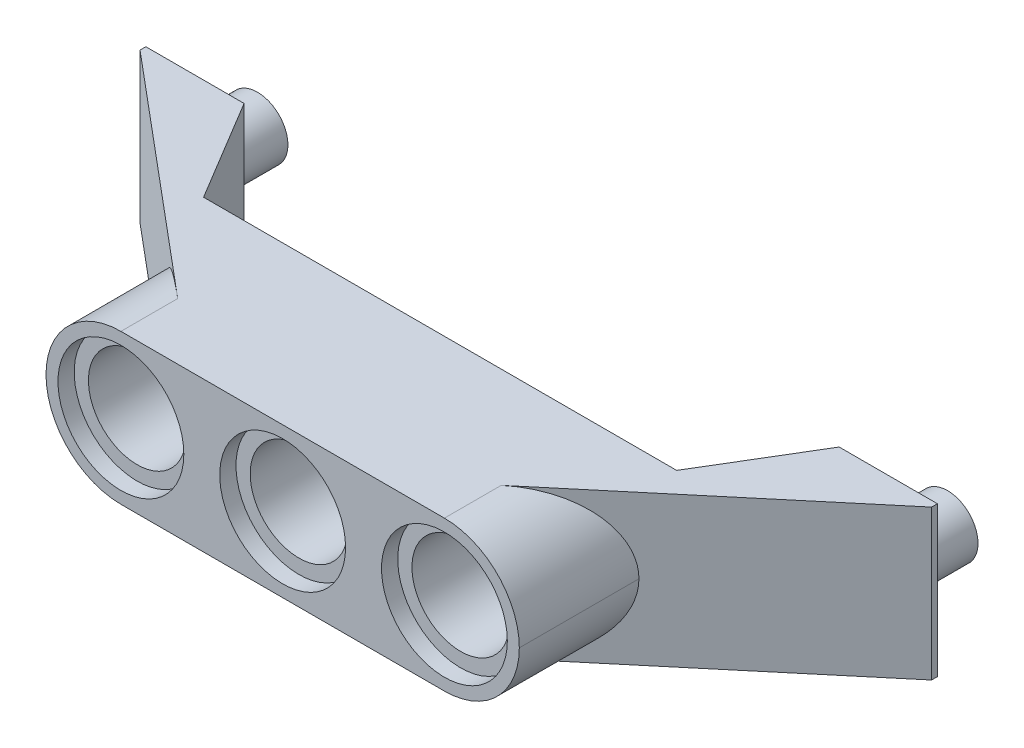
ISO-10303-21;
HEADER;
FILE_DESCRIPTION(('STEP AP214'),'2;1');
FILE_NAME('part.step','',(''),(''),'','','');
FILE_SCHEMA(('AUTOMOTIVE_DESIGN { 1 0 10303 214 1 1 1 1 }'));
ENDSEC;
DATA;
#1=APPLICATION_CONTEXT('core data for automotive mechanical design processes');
#2=APPLICATION_PROTOCOL_DEFINITION('international standard','automotive_design',2000,#1);
#3=PRODUCT_CONTEXT('',#1,'mechanical');
#4=PRODUCT('Part','Part','',(#3));
#5=PRODUCT_RELATED_PRODUCT_CATEGORY('part','',(#4));
#6=PRODUCT_DEFINITION_FORMATION('','',#4);
#7=PRODUCT_DEFINITION_CONTEXT('part definition',#1,'design');
#8=PRODUCT_DEFINITION('design','',#6,#7);
#9=PRODUCT_DEFINITION_SHAPE('','',#8);
#10=(LENGTH_UNIT() NAMED_UNIT(*) SI_UNIT(.MILLI.,.METRE.));
#11=(NAMED_UNIT(*) PLANE_ANGLE_UNIT() SI_UNIT($,.RADIAN.));
#12=(NAMED_UNIT(*) SI_UNIT($,.STERADIAN.) SOLID_ANGLE_UNIT());
#13=UNCERTAINTY_MEASURE_WITH_UNIT(LENGTH_MEASURE(1.E-05),#10,'distance_accuracy_value','');
#14=(GEOMETRIC_REPRESENTATION_CONTEXT(3) GLOBAL_UNCERTAINTY_ASSIGNED_CONTEXT((#13)) GLOBAL_UNIT_ASSIGNED_CONTEXT((#10,
#11,#12)) REPRESENTATION_CONTEXT('',''));
#15=CARTESIAN_POINT('',(0.,0.,0.));
#16=DIRECTION('',(0.,0.,1.));
#17=DIRECTION('',(1.,0.,0.));
#18=AXIS2_PLACEMENT_3D('',#15,#16,#17);
#19=CARTESIAN_POINT('',(0.,0.,0.));
#20=DIRECTION('',(0.,0.,1.));
#21=DIRECTION('',(1.,0.,0.));
#22=AXIS2_PLACEMENT_3D('',#19,#20,#21);
#23=PLANE('',#22);
#24=CARTESIAN_POINT('',(8.17748169838946,1.94617862371889,0.));
#25=DIRECTION('',(0.,0.,-1.));
#26=DIRECTION('',(-1.,0.,0.));
#27=AXIS2_PLACEMENT_3D('',#24,#25,#26);
#28=CIRCLE('',#27,3.1);
#29=CARTESIAN_POINT('',(5.07748169838946,1.94617862371889,0.));
#30=VERTEX_POINT('',#29);
#31=EDGE_CURVE('E215',#30,#30,#28,.T.);
#32=ORIENTED_EDGE('',*,*,#31,.F.);
#33=EDGE_LOOP('',(#32));
#34=FACE_BOUND('',#33,.T.);
#35=CARTESIAN_POINT('',(0.20748169838946,1.94617862371889,0.));
#36=DIRECTION('',(0.,0.,-1.));
#37=DIRECTION('',(-1.,0.,0.));
#38=AXIS2_PLACEMENT_3D('',#35,#36,#37);
#39=CIRCLE('',#38,3.1);
#40=CARTESIAN_POINT('',(-2.89251830161054,1.94617862371889,0.));
#41=VERTEX_POINT('',#40);
#42=EDGE_CURVE('E221',#41,#41,#39,.T.);
#43=ORIENTED_EDGE('',*,*,#42,.F.);
#44=EDGE_LOOP('',(#43));
#45=FACE_BOUND('',#44,.T.);
#46=CARTESIAN_POINT('',(-7.76251830161054,1.94617862371888,0.));
#47=DIRECTION('',(0.,0.,-1.));
#48=DIRECTION('',(-1.,0.,0.));
#49=AXIS2_PLACEMENT_3D('',#46,#47,#48);
#50=CIRCLE('',#49,3.1);
#51=CARTESIAN_POINT('',(-10.8625183016105,1.94617862371888,0.));
#52=VERTEX_POINT('',#51);
#53=EDGE_CURVE('E210',#52,#52,#50,.T.);
#54=ORIENTED_EDGE('',*,*,#53,.F.);
#55=EDGE_LOOP('',(#54));
#56=FACE_BOUND('',#55,.T.);
#57=DIRECTION('',(0.,-1.,0.));
#58=VECTOR('',#57,1.);
#59=CARTESIAN_POINT('',(-11.4525183016105,-1.74382137628111,0.));
#60=LINE('',#59,#58);
#61=CARTESIAN_POINT('',(-11.4525183016105,5.63617862371889,0.));
#62=VERTEX_POINT('',#61);
#63=CARTESIAN_POINT('',(-11.4525183016105,-1.74382137628111,0.));
#64=VERTEX_POINT('',#63);
#65=EDGE_CURVE('E176',#62,#64,#60,.T.);
#66=ORIENTED_EDGE('',*,*,#65,.F.);
#67=DIRECTION('',(-1.,0.,0.));
#68=VECTOR('',#67,1.);
#69=CARTESIAN_POINT('',(-11.4525183016105,5.63617862371889,0.));
#70=LINE('',#69,#68);
#71=CARTESIAN_POINT('',(11.8674816983895,5.63617862371889,0.));
#72=VERTEX_POINT('',#71);
#73=EDGE_CURVE('E253',#72,#62,#70,.T.);
#74=ORIENTED_EDGE('',*,*,#73,.F.);
#75=DIRECTION('',(0.,1.,0.));
#76=VECTOR('',#75,1.);
#77=CARTESIAN_POINT('',(11.8674816983895,-1.74382137628111,0.));
#78=LINE('',#77,#76);
#79=CARTESIAN_POINT('',(11.8674816983895,-1.74382137628111,0.));
#80=VERTEX_POINT('',#79);
#81=EDGE_CURVE('E190',#80,#72,#78,.T.);
#82=ORIENTED_EDGE('',*,*,#81,.F.);
#83=DIRECTION('',(1.,0.,0.));
#84=VECTOR('',#83,1.);
#85=CARTESIAN_POINT('',(-11.4525183016105,-1.74382137628111,0.));
#86=LINE('',#85,#84);
#87=EDGE_CURVE('E257',#64,#80,#86,.T.);
#88=ORIENTED_EDGE('',*,*,#87,.F.);
#89=EDGE_LOOP('',(#66,#74,#82,#88));
#90=FACE_BOUND('',#89,.T.);
#91=ADVANCED_FACE('F33',(#34,#45,#56,#90),#23,.F.);
#92=CARTESIAN_POINT('',(8.17748169838946,1.94617862371889,0.));
#93=DIRECTION('',(0.,0.,1.));
#94=DIRECTION('',(1.,0.,0.));
#95=AXIS2_PLACEMENT_3D('',#92,#93,#94);
#96=CYLINDRICAL_SURFACE('',#95,2.4);
#97=CARTESIAN_POINT('',(8.17748169838946,1.94617862371889,6.96));
#98=DIRECTION('',(0.,0.,1.));
#99=DIRECTION('',(1.,0.,0.));
#100=AXIS2_PLACEMENT_3D('',#97,#98,#99);
#101=CIRCLE('',#100,2.4);
#102=CARTESIAN_POINT('',(10.5774816983895,1.94617862371889,6.96));
#103=VERTEX_POINT('',#102);
#104=EDGE_CURVE('E260',#103,#103,#101,.F.);
#105=ORIENTED_EDGE('',*,*,#104,.F.);
#106=EDGE_LOOP('',(#105));
#107=FACE_BOUND('',#106,.T.);
#108=CARTESIAN_POINT('',(8.17748169838946,1.94617862371889,0.8));
#109=DIRECTION('',(0.,0.,-1.));
#110=DIRECTION('',(-1.,0.,0.));
#111=AXIS2_PLACEMENT_3D('',#108,#109,#110);
#112=CIRCLE('',#111,2.4);
#113=CARTESIAN_POINT('',(5.77748169838946,1.94617862371889,0.8));
#114=VERTEX_POINT('',#113);
#115=EDGE_CURVE('E248',#114,#114,#112,.F.);
#116=ORIENTED_EDGE('',*,*,#115,.F.);
#117=EDGE_LOOP('',(#116));
#118=FACE_BOUND('',#117,.T.);
#119=ADVANCED_FACE('F373',(#107,#118),#96,.F.);
#120=CARTESIAN_POINT('',(0.20748169838946,1.94617862371889,0.));
#121=DIRECTION('',(0.,0.,1.));
#122=DIRECTION('',(1.,0.,0.));
#123=AXIS2_PLACEMENT_3D('',#120,#121,#122);
#124=CYLINDRICAL_SURFACE('',#123,2.4);
#125=CARTESIAN_POINT('',(0.20748169838946,1.94617862371889,6.96));
#126=DIRECTION('',(0.,0.,1.));
#127=DIRECTION('',(1.,0.,0.));
#128=AXIS2_PLACEMENT_3D('',#125,#126,#127);
#129=CIRCLE('',#128,2.4);
#130=CARTESIAN_POINT('',(2.60748169838946,1.94617862371889,6.96));
#131=VERTEX_POINT('',#130);
#132=EDGE_CURVE('E265',#131,#131,#129,.F.);
#133=ORIENTED_EDGE('',*,*,#132,.F.);
#134=EDGE_LOOP('',(#133));
#135=FACE_BOUND('',#134,.T.);
#136=CARTESIAN_POINT('',(0.20748169838946,1.94617862371889,0.8));
#137=DIRECTION('',(0.,0.,-1.));
#138=DIRECTION('',(-1.,0.,0.));
#139=AXIS2_PLACEMENT_3D('',#136,#137,#138);
#140=CIRCLE('',#139,2.4);
#141=CARTESIAN_POINT('',(-2.19251830161054,1.94617862371889,0.8));
#142=VERTEX_POINT('',#141);
#143=EDGE_CURVE('E272',#142,#142,#140,.F.);
#144=ORIENTED_EDGE('',*,*,#143,.F.);
#145=EDGE_LOOP('',(#144));
#146=FACE_BOUND('',#145,.T.);
#147=ADVANCED_FACE('F379',(#135,#146),#124,.F.);
#148=CARTESIAN_POINT('',(-7.76251830161054,1.94617862371888,0.));
#149=DIRECTION('',(0.,0.,1.));
#150=DIRECTION('',(1.,0.,0.));
#151=AXIS2_PLACEMENT_3D('',#148,#149,#150);
#152=CYLINDRICAL_SURFACE('',#151,2.4);
#153=CARTESIAN_POINT('',(-7.76251830161054,1.94617862371888,6.96));
#154=DIRECTION('',(0.,0.,1.));
#155=DIRECTION('',(1.,0.,0.));
#156=AXIS2_PLACEMENT_3D('',#153,#154,#155);
#157=CIRCLE('',#156,2.4);
#158=CARTESIAN_POINT('',(-5.36251830161054,1.94617862371888,6.96));
#159=VERTEX_POINT('',#158);
#160=EDGE_CURVE('E232',#159,#159,#157,.F.);
#161=ORIENTED_EDGE('',*,*,#160,.F.);
#162=EDGE_LOOP('',(#161));
#163=FACE_BOUND('',#162,.T.);
#164=CARTESIAN_POINT('',(-7.76251830161054,1.94617862371888,0.8));
#165=DIRECTION('',(0.,0.,-1.));
#166=DIRECTION('',(-1.,0.,0.));
#167=AXIS2_PLACEMENT_3D('',#164,#165,#166);
#168=CIRCLE('',#167,2.4);
#169=CARTESIAN_POINT('',(-10.1625183016105,1.94617862371888,0.8));
#170=VERTEX_POINT('',#169);
#171=EDGE_CURVE('E214',#170,#170,#168,.F.);
#172=ORIENTED_EDGE('',*,*,#171,.F.);
#173=EDGE_LOOP('',(#172));
#174=FACE_BOUND('',#173,.T.);
#175=ADVANCED_FACE('F389',(#163,#174),#152,.F.);
#176=CARTESIAN_POINT('',(-11.4525183016105,-1.74382137628111,7.76));
#177=DIRECTION('',(0.,1.,0.));
#178=DIRECTION('',(0.,0.,1.));
#179=AXIS2_PLACEMENT_3D('',#176,#177,#178);
#180=PLANE('',#179);
#181=DIRECTION('',(0.766044443118974,0.,-0.642787609686544));
#182=VECTOR('',#181,1.);
#183=CARTESIAN_POINT('',(19.7074816983895,-1.74382137628111,-4.71279704941836));
#184=LINE('',#183,#182);
#185=CARTESIAN_POINT('',(19.7074816983895,-1.74382137628111,-4.71279704941836));
#186=VERTEX_POINT('',#185);
#187=CARTESIAN_POINT('',(8.17748169838946,-1.74382137628111,4.96202169805579));
#188=VERTEX_POINT('',#187);
#189=EDGE_CURVE('E282',#186,#188,#184,.F.);
#190=ORIENTED_EDGE('',*,*,#189,.T.);
#191=DIRECTION('',(0.,0.,-1.));
#192=VECTOR('',#191,1.);
#193=CARTESIAN_POINT('',(8.17748169838946,-1.74382137628111,7.76));
#194=LINE('',#193,#192);
#195=CARTESIAN_POINT('',(8.17748169838946,-1.74382137628111,7.76));
#196=VERTEX_POINT('',#195);
#197=EDGE_CURVE('E310',#188,#196,#194,.F.);
#198=ORIENTED_EDGE('',*,*,#197,.T.);
#199=DIRECTION('',(1.,0.,0.));
#200=VECTOR('',#199,1.);
#201=CARTESIAN_POINT('',(-11.4525183016105,-1.74382137628111,7.76));
#202=LINE('',#201,#200);
#203=CARTESIAN_POINT('',(-7.76251830161054,-1.74382137628111,7.76));
#204=VERTEX_POINT('',#203);
#205=EDGE_CURVE('E249',#204,#196,#202,.T.);
#206=ORIENTED_EDGE('',*,*,#205,.F.);
#207=DIRECTION('',(0.,0.,-1.));
#208=VECTOR('',#207,1.);
#209=CARTESIAN_POINT('',(-7.76251830161054,-1.74382137628111,7.76));
#210=LINE('',#209,#208);
#211=CARTESIAN_POINT('',(-7.76251830161054,-1.74382137628111,4.96202169805579));
#212=VERTEX_POINT('',#211);
#213=EDGE_CURVE('E307',#204,#212,#210,.T.);
#214=ORIENTED_EDGE('',*,*,#213,.T.);
#215=DIRECTION('',(0.766044443118974,0.,0.642787609686544));
#216=VECTOR('',#215,1.);
#217=CARTESIAN_POINT('',(-19.2925183016105,-1.74382137628111,-4.71279704941836));
#218=LINE('',#217,#216);
#219=CARTESIAN_POINT('',(-19.2925183016105,-1.74382137628111,-4.71279704941836));
#220=VERTEX_POINT('',#219);
#221=EDGE_CURVE('E289',#212,#220,#218,.F.);
#222=ORIENTED_EDGE('',*,*,#221,.T.);
#223=DIRECTION('',(0.,0.,1.));
#224=VECTOR('',#223,1.);
#225=CARTESIAN_POINT('',(-19.2925183016105,-1.74382137628111,0.));
#226=LINE('',#225,#224);
#227=CARTESIAN_POINT('',(-19.2925183016105,-1.74382137628111,-5.));
#228=VERTEX_POINT('',#227);
#229=EDGE_CURVE('E159',#228,#220,#226,.T.);
#230=ORIENTED_EDGE('',*,*,#229,.F.);
#231=DIRECTION('',(-1.,0.,0.));
#232=VECTOR('',#231,1.);
#233=CARTESIAN_POINT('',(-19.2925183016105,-1.74382137628111,-5.));
#234=LINE('',#233,#232);
#235=CARTESIAN_POINT('',(-14.4525183016106,-1.74382137628111,-5.));
#236=VERTEX_POINT('',#235);
#237=EDGE_CURVE('E171',#236,#228,#234,.T.);
#238=ORIENTED_EDGE('',*,*,#237,.F.);
#239=DIRECTION('',(0.515038074910056,0.,0.857167300702111));
#240=VECTOR('',#239,1.);
#241=CARTESIAN_POINT('',(-14.4525183016106,-1.74382137628111,-5.));
#242=LINE('',#241,#240);
#243=CARTESIAN_POINT('',(-11.4525183016105,-1.74382137628111,-0.0071615529484521));
#244=VERTEX_POINT('',#243);
#245=EDGE_CURVE('E302',#236,#244,#242,.T.);
#246=ORIENTED_EDGE('',*,*,#245,.T.);
#247=DIRECTION('',(0.,0.,1.));
#248=VECTOR('',#247,1.);
#249=CARTESIAN_POINT('',(-11.4525183016105,-1.74382137628111,-5.));
#250=LINE('',#249,#248);
#251=EDGE_CURVE('E185',#244,#64,#250,.T.);
#252=ORIENTED_EDGE('',*,*,#251,.T.);
#253=ORIENTED_EDGE('',*,*,#87,.T.);
#254=DIRECTION('',(0.,0.,1.));
#255=VECTOR('',#254,1.);
#256=CARTESIAN_POINT('',(11.8674816983895,-1.74382137628111,-5.));
#257=LINE('',#256,#255);
#258=CARTESIAN_POINT('',(11.8674816983895,-1.74382137628111,-0.00716155294845904));
#259=VERTEX_POINT('',#258);
#260=EDGE_CURVE('E203',#259,#80,#257,.T.);
#261=ORIENTED_EDGE('',*,*,#260,.F.);
#262=DIRECTION('',(-0.515038074910056,0.,0.857167300702111));
#263=VECTOR('',#262,1.);
#264=CARTESIAN_POINT('',(14.8674816983895,-1.74382137628111,-5.));
#265=LINE('',#264,#263);
#266=CARTESIAN_POINT('',(14.8674816983895,-1.74382137628111,-5.));
#267=VERTEX_POINT('',#266);
#268=EDGE_CURVE('E298',#259,#267,#265,.F.);
#269=ORIENTED_EDGE('',*,*,#268,.T.);
#270=DIRECTION('',(-1.,0.,0.));
#271=VECTOR('',#270,1.);
#272=CARTESIAN_POINT('',(19.7074816983895,-1.74382137628111,-5.));
#273=LINE('',#272,#271);
#274=CARTESIAN_POINT('',(19.7074816983895,-1.74382137628111,-5.));
#275=VERTEX_POINT('',#274);
#276=EDGE_CURVE('E194',#275,#267,#273,.T.);
#277=ORIENTED_EDGE('',*,*,#276,.F.);
#278=DIRECTION('',(0.,0.,-1.));
#279=VECTOR('',#278,1.);
#280=CARTESIAN_POINT('',(19.7074816983895,-1.74382137628111,0.));
#281=LINE('',#280,#279);
#282=EDGE_CURVE('E208',#186,#275,#281,.T.);
#283=ORIENTED_EDGE('',*,*,#282,.F.);
#284=EDGE_LOOP('',(#190,#198,#206,#214,#222,#230,#238,#246,#252,#253,#261,#269,#277,#283));
#285=FACE_BOUND('',#284,.T.);
#286=ADVANCED_FACE('F349',(#285),#180,.F.);
#287=CARTESIAN_POINT('',(-11.4525183016105,5.63617862371889,7.76));
#288=DIRECTION('',(0.,-1.,0.));
#289=DIRECTION('',(0.,0.,-1.));
#290=AXIS2_PLACEMENT_3D('',#287,#288,#289);
#291=PLANE('',#290);
#292=DIRECTION('',(-1.,0.,0.));
#293=VECTOR('',#292,1.);
#294=CARTESIAN_POINT('',(-11.4525183016105,5.63617862371889,7.76));
#295=LINE('',#294,#293);
#296=CARTESIAN_POINT('',(8.17748169838946,5.63617862371889,7.76));
#297=VERTEX_POINT('',#296);
#298=CARTESIAN_POINT('',(-7.76251830161054,5.63617862371889,7.76));
#299=VERTEX_POINT('',#298);
#300=EDGE_CURVE('E252',#297,#299,#295,.T.);
#301=ORIENTED_EDGE('',*,*,#300,.F.);
#302=DIRECTION('',(0.,0.,-1.));
#303=VECTOR('',#302,1.);
#304=CARTESIAN_POINT('',(8.17748169838946,5.63617862371889,7.76));
#305=LINE('',#304,#303);
#306=CARTESIAN_POINT('',(8.17748169838946,5.63617862371889,4.96202169805579));
#307=VERTEX_POINT('',#306);
#308=EDGE_CURVE('E324',#297,#307,#305,.T.);
#309=ORIENTED_EDGE('',*,*,#308,.T.);
#310=DIRECTION('',(-0.766044443118974,0.,0.642787609686544));
#311=VECTOR('',#310,1.);
#312=CARTESIAN_POINT('',(19.7074816983895,5.63617862371889,-4.71279704941836));
#313=LINE('',#312,#311);
#314=CARTESIAN_POINT('',(19.7074816983895,5.63617862371889,-4.71279704941836));
#315=VERTEX_POINT('',#314);
#316=EDGE_CURVE('E284',#307,#315,#313,.F.);
#317=ORIENTED_EDGE('',*,*,#316,.T.);
#318=DIRECTION('',(0.,0.,1.));
#319=VECTOR('',#318,1.);
#320=CARTESIAN_POINT('',(19.7074816983895,5.63617862371889,0.));
#321=LINE('',#320,#319);
#322=CARTESIAN_POINT('',(19.7074816983895,5.63617862371889,-5.));
#323=VERTEX_POINT('',#322);
#324=EDGE_CURVE('E158',#323,#315,#321,.T.);
#325=ORIENTED_EDGE('',*,*,#324,.F.);
#326=DIRECTION('',(1.,0.,0.));
#327=VECTOR('',#326,1.);
#328=CARTESIAN_POINT('',(19.7074816983895,5.63617862371889,-5.));
#329=LINE('',#328,#327);
#330=CARTESIAN_POINT('',(14.8674816983895,5.63617862371889,-5.));
#331=VERTEX_POINT('',#330);
#332=EDGE_CURVE('E197',#331,#323,#329,.T.);
#333=ORIENTED_EDGE('',*,*,#332,.F.);
#334=DIRECTION('',(0.515038074910056,0.,-0.857167300702111));
#335=VECTOR('',#334,1.);
#336=CARTESIAN_POINT('',(14.8674816983895,5.63617862371889,-5.));
#337=LINE('',#336,#335);
#338=CARTESIAN_POINT('',(11.8674816983895,5.63617862371889,-0.00716155294845904));
#339=VERTEX_POINT('',#338);
#340=EDGE_CURVE('E294',#331,#339,#337,.F.);
#341=ORIENTED_EDGE('',*,*,#340,.T.);
#342=DIRECTION('',(0.,0.,1.));
#343=VECTOR('',#342,1.);
#344=CARTESIAN_POINT('',(11.8674816983895,5.63617862371889,-5.));
#345=LINE('',#344,#343);
#346=EDGE_CURVE('E199',#339,#72,#345,.T.);
#347=ORIENTED_EDGE('',*,*,#346,.T.);
#348=ORIENTED_EDGE('',*,*,#73,.T.);
#349=DIRECTION('',(0.,0.,1.));
#350=VECTOR('',#349,1.);
#351=CARTESIAN_POINT('',(-11.4525183016105,5.63617862371889,-5.));
#352=LINE('',#351,#350);
#353=CARTESIAN_POINT('',(-11.4525183016105,5.63617862371889,-0.0071615529484521));
#354=VERTEX_POINT('',#353);
#355=EDGE_CURVE('E188',#354,#62,#352,.T.);
#356=ORIENTED_EDGE('',*,*,#355,.F.);
#357=DIRECTION('',(-0.515038074910056,0.,-0.857167300702111));
#358=VECTOR('',#357,1.);
#359=CARTESIAN_POINT('',(-14.4525183016106,5.63617862371889,-5.));
#360=LINE('',#359,#358);
#361=CARTESIAN_POINT('',(-14.4525183016106,5.63617862371889,-5.));
#362=VERTEX_POINT('',#361);
#363=EDGE_CURVE('E167',#354,#362,#360,.T.);
#364=ORIENTED_EDGE('',*,*,#363,.T.);
#365=DIRECTION('',(1.,0.,0.));
#366=VECTOR('',#365,1.);
#367=CARTESIAN_POINT('',(-19.2925183016105,5.63617862371889,-5.));
#368=LINE('',#367,#366);
#369=CARTESIAN_POINT('',(-19.2925183016105,5.63617862371889,-5.));
#370=VERTEX_POINT('',#369);
#371=EDGE_CURVE('E162',#370,#362,#368,.T.);
#372=ORIENTED_EDGE('',*,*,#371,.F.);
#373=DIRECTION('',(0.,0.,-1.));
#374=VECTOR('',#373,1.);
#375=CARTESIAN_POINT('',(-19.2925183016105,5.63617862371889,0.));
#376=LINE('',#375,#374);
#377=CARTESIAN_POINT('',(-19.2925183016105,5.63617862371889,-4.71279704941836));
#378=VERTEX_POINT('',#377);
#379=EDGE_CURVE('E149',#378,#370,#376,.T.);
#380=ORIENTED_EDGE('',*,*,#379,.F.);
#381=DIRECTION('',(-0.766044443118974,0.,-0.642787609686544));
#382=VECTOR('',#381,1.);
#383=CARTESIAN_POINT('',(-19.2925183016105,5.63617862371889,-4.71279704941836));
#384=LINE('',#383,#382);
#385=CARTESIAN_POINT('',(-7.76251830161054,5.63617862371889,4.96202169805579));
#386=VERTEX_POINT('',#385);
#387=EDGE_CURVE('E287',#378,#386,#384,.F.);
#388=ORIENTED_EDGE('',*,*,#387,.T.);
#389=DIRECTION('',(0.,0.,-1.));
#390=VECTOR('',#389,1.);
#391=CARTESIAN_POINT('',(-7.76251830161054,5.63617862371889,7.76));
#392=LINE('',#391,#390);
#393=EDGE_CURVE('E321',#386,#299,#392,.F.);
#394=ORIENTED_EDGE('',*,*,#393,.T.);
#395=EDGE_LOOP('',(#301,#309,#317,#325,#333,#341,#347,#348,#356,#364,#372,#380,#388,#394));
#396=FACE_BOUND('',#395,.T.);
#397=ADVANCED_FACE('F164',(#396),#291,.F.);
#398=CARTESIAN_POINT('',(0.,0.,7.76));
#399=DIRECTION('',(0.,0.,1.));
#400=DIRECTION('',(1.,0.,0.));
#401=AXIS2_PLACEMENT_3D('',#398,#399,#400);
#402=PLANE('',#401);
#403=CARTESIAN_POINT('',(-7.76251830161054,1.94617862371888,7.76));
#404=DIRECTION('',(0.,0.,1.));
#405=DIRECTION('',(1.,0.,0.));
#406=AXIS2_PLACEMENT_3D('',#403,#404,#405);
#407=CIRCLE('',#406,3.1);
#408=CARTESIAN_POINT('',(-4.66251830161054,1.94617862371888,7.76));
#409=VERTEX_POINT('',#408);
#410=EDGE_CURVE('E233',#409,#409,#407,.T.);
#411=ORIENTED_EDGE('',*,*,#410,.F.);
#412=EDGE_LOOP('',(#411));
#413=FACE_BOUND('',#412,.T.);
#414=CARTESIAN_POINT('',(0.20748169838946,1.94617862371889,7.76));
#415=DIRECTION('',(0.,0.,1.));
#416=DIRECTION('',(1.,0.,0.));
#417=AXIS2_PLACEMENT_3D('',#414,#415,#416);
#418=CIRCLE('',#417,3.1);
#419=CARTESIAN_POINT('',(3.30748169838946,1.94617862371889,7.76));
#420=VERTEX_POINT('',#419);
#421=EDGE_CURVE('E239',#420,#420,#418,.T.);
#422=ORIENTED_EDGE('',*,*,#421,.F.);
#423=EDGE_LOOP('',(#422));
#424=FACE_BOUND('',#423,.T.);
#425=CARTESIAN_POINT('',(8.17748169838946,1.94617862371889,7.76));
#426=DIRECTION('',(0.,0.,1.));
#427=DIRECTION('',(1.,0.,0.));
#428=AXIS2_PLACEMENT_3D('',#425,#426,#427);
#429=CIRCLE('',#428,3.1);
#430=CARTESIAN_POINT('',(11.2774816983895,1.94617862371889,7.76));
#431=VERTEX_POINT('',#430);
#432=EDGE_CURVE('E245',#431,#431,#429,.T.);
#433=ORIENTED_EDGE('',*,*,#432,.F.);
#434=EDGE_LOOP('',(#433));
#435=FACE_BOUND('',#434,.T.);
#436=ORIENTED_EDGE('',*,*,#205,.T.);
#437=CARTESIAN_POINT('',(8.17748169838946,1.94617862371889,7.76));
#438=DIRECTION('',(0.,0.,1.));
#439=DIRECTION('',(1.,0.,0.));
#440=AXIS2_PLACEMENT_3D('',#437,#438,#439);
#441=CIRCLE('',#440,3.69);
#442=CARTESIAN_POINT('',(11.8674816983895,1.94617862371889,7.76));
#443=VERTEX_POINT('',#442);
#444=EDGE_CURVE('E319',#196,#443,#441,.T.);
#445=ORIENTED_EDGE('',*,*,#444,.T.);
#446=CARTESIAN_POINT('',(8.17748169838946,1.94617862371889,7.76));
#447=DIRECTION('',(0.,0.,1.));
#448=DIRECTION('',(1.,0.,0.));
#449=AXIS2_PLACEMENT_3D('',#446,#447,#448);
#450=CIRCLE('',#449,3.69);
#451=EDGE_CURVE('E317',#443,#297,#450,.T.);
#452=ORIENTED_EDGE('',*,*,#451,.T.);
#453=ORIENTED_EDGE('',*,*,#300,.T.);
#454=CARTESIAN_POINT('',(-7.76251830161054,1.94617862371889,7.76));
#455=DIRECTION('',(0.,0.,1.));
#456=DIRECTION('',(1.,0.,0.));
#457=AXIS2_PLACEMENT_3D('',#454,#455,#456);
#458=CIRCLE('',#457,3.69);
#459=CARTESIAN_POINT('',(-11.4525183016105,1.94617862371889,7.76));
#460=VERTEX_POINT('',#459);
#461=EDGE_CURVE('E315',#299,#460,#458,.T.);
#462=ORIENTED_EDGE('',*,*,#461,.T.);
#463=CARTESIAN_POINT('',(-7.76251830161054,1.94617862371889,7.76));
#464=DIRECTION('',(0.,0.,1.));
#465=DIRECTION('',(1.,0.,0.));
#466=AXIS2_PLACEMENT_3D('',#463,#464,#465);
#467=CIRCLE('',#466,3.69);
#468=EDGE_CURVE('E313',#460,#204,#467,.T.);
#469=ORIENTED_EDGE('',*,*,#468,.T.);
#470=EDGE_LOOP('',(#436,#445,#452,#453,#462,#469));
#471=FACE_BOUND('',#470,.T.);
#472=ADVANCED_FACE('F347',(#413,#424,#435,#471),#402,.T.);
#473=CARTESIAN_POINT('',(-7.76251830161054,1.94617862371888,6.96));
#474=DIRECTION('',(0.,0.,1.));
#475=DIRECTION('',(1.,0.,0.));
#476=AXIS2_PLACEMENT_3D('',#473,#474,#475);
#477=PLANE('',#476);
#478=CARTESIAN_POINT('',(-7.76251830161054,1.94617862371888,6.96));
#479=DIRECTION('',(0.,0.,1.));
#480=DIRECTION('',(1.,0.,0.));
#481=AXIS2_PLACEMENT_3D('',#478,#479,#480);
#482=CIRCLE('',#481,3.1);
#483=CARTESIAN_POINT('',(-4.66251830161054,1.94617862371888,6.96));
#484=VERTEX_POINT('',#483);
#485=EDGE_CURVE('E229',#484,#484,#482,.T.);
#486=ORIENTED_EDGE('',*,*,#485,.T.);
#487=EDGE_LOOP('',(#486));
#488=FACE_BOUND('',#487,.T.);
#489=ORIENTED_EDGE('',*,*,#160,.T.);
#490=EDGE_LOOP('',(#489));
#491=FACE_BOUND('',#490,.T.);
#492=ADVANCED_FACE('F423',(#488,#491),#477,.T.);
#493=CARTESIAN_POINT('',(-7.76251830161054,1.94617862371888,6.96));
#494=DIRECTION('',(0.,0.,1.));
#495=DIRECTION('',(1.,0.,0.));
#496=AXIS2_PLACEMENT_3D('',#493,#494,#495);
#497=CYLINDRICAL_SURFACE('',#496,3.1);
#498=ORIENTED_EDGE('',*,*,#485,.F.);
#499=EDGE_LOOP('',(#498));
#500=FACE_BOUND('',#499,.T.);
#501=ORIENTED_EDGE('',*,*,#410,.T.);
#502=EDGE_LOOP('',(#501));
#503=FACE_BOUND('',#502,.T.);
#504=ADVANCED_FACE('F419',(#500,#503),#497,.F.);
#505=CARTESIAN_POINT('',(0.20748169838946,1.94617862371889,6.96));
#506=DIRECTION('',(0.,0.,1.));
#507=DIRECTION('',(1.,0.,0.));
#508=AXIS2_PLACEMENT_3D('',#505,#506,#507);
#509=PLANE('',#508);
#510=CARTESIAN_POINT('',(0.20748169838946,1.94617862371889,6.96));
#511=DIRECTION('',(0.,0.,1.));
#512=DIRECTION('',(1.,0.,0.));
#513=AXIS2_PLACEMENT_3D('',#510,#511,#512);
#514=CIRCLE('',#513,3.1);
#515=CARTESIAN_POINT('',(3.30748169838946,1.94617862371889,6.96));
#516=VERTEX_POINT('',#515);
#517=EDGE_CURVE('E236',#516,#516,#514,.T.);
#518=ORIENTED_EDGE('',*,*,#517,.T.);
#519=EDGE_LOOP('',(#518));
#520=FACE_BOUND('',#519,.T.);
#521=ORIENTED_EDGE('',*,*,#132,.T.);
#522=EDGE_LOOP('',(#521));
#523=FACE_BOUND('',#522,.T.);
#524=ADVANCED_FACE('F415',(#520,#523),#509,.T.);
#525=CARTESIAN_POINT('',(0.20748169838946,1.94617862371889,6.96));
#526=DIRECTION('',(0.,0.,1.));
#527=DIRECTION('',(1.,0.,0.));
#528=AXIS2_PLACEMENT_3D('',#525,#526,#527);
#529=CYLINDRICAL_SURFACE('',#528,3.1);
#530=ORIENTED_EDGE('',*,*,#517,.F.);
#531=EDGE_LOOP('',(#530));
#532=FACE_BOUND('',#531,.T.);
#533=ORIENTED_EDGE('',*,*,#421,.T.);
#534=EDGE_LOOP('',(#533));
#535=FACE_BOUND('',#534,.T.);
#536=ADVANCED_FACE('F411',(#532,#535),#529,.F.);
#537=CARTESIAN_POINT('',(8.17748169838946,1.94617862371889,6.96));
#538=DIRECTION('',(0.,0.,1.));
#539=DIRECTION('',(1.,0.,0.));
#540=AXIS2_PLACEMENT_3D('',#537,#538,#539);
#541=PLANE('',#540);
#542=CARTESIAN_POINT('',(8.17748169838946,1.94617862371889,6.96));
#543=DIRECTION('',(0.,0.,1.));
#544=DIRECTION('',(1.,0.,0.));
#545=AXIS2_PLACEMENT_3D('',#542,#543,#544);
#546=CIRCLE('',#545,3.1);
#547=CARTESIAN_POINT('',(11.2774816983895,1.94617862371889,6.96));
#548=VERTEX_POINT('',#547);
#549=EDGE_CURVE('E242',#548,#548,#546,.T.);
#550=ORIENTED_EDGE('',*,*,#549,.T.);
#551=EDGE_LOOP('',(#550));
#552=FACE_BOUND('',#551,.T.);
#553=ORIENTED_EDGE('',*,*,#104,.T.);
#554=EDGE_LOOP('',(#553));
#555=FACE_BOUND('',#554,.T.);
#556=ADVANCED_FACE('F407',(#552,#555),#541,.T.);
#557=CARTESIAN_POINT('',(8.17748169838946,1.94617862371889,6.96));
#558=DIRECTION('',(0.,0.,1.));
#559=DIRECTION('',(1.,0.,0.));
#560=AXIS2_PLACEMENT_3D('',#557,#558,#559);
#561=CYLINDRICAL_SURFACE('',#560,3.1);
#562=ORIENTED_EDGE('',*,*,#549,.F.);
#563=EDGE_LOOP('',(#562));
#564=FACE_BOUND('',#563,.T.);
#565=ORIENTED_EDGE('',*,*,#432,.T.);
#566=EDGE_LOOP('',(#565));
#567=FACE_BOUND('',#566,.T.);
#568=ADVANCED_FACE('F403',(#564,#567),#561,.F.);
#569=CARTESIAN_POINT('',(-7.76251830161054,1.94617862371888,0.8));
#570=DIRECTION('',(0.,0.,-1.));
#571=DIRECTION('',(-1.,0.,0.));
#572=AXIS2_PLACEMENT_3D('',#569,#570,#571);
#573=PLANE('',#572);
#574=CARTESIAN_POINT('',(-7.76251830161054,1.94617862371888,0.8));
#575=DIRECTION('',(0.,0.,-1.));
#576=DIRECTION('',(-1.,0.,0.));
#577=AXIS2_PLACEMENT_3D('',#574,#575,#576);
#578=CIRCLE('',#577,3.1);
#579=CARTESIAN_POINT('',(-10.8625183016105,1.94617862371888,0.8));
#580=VERTEX_POINT('',#579);
#581=EDGE_CURVE('E224',#580,#580,#578,.T.);
#582=ORIENTED_EDGE('',*,*,#581,.T.);
#583=EDGE_LOOP('',(#582));
#584=FACE_BOUND('',#583,.T.);
#585=ORIENTED_EDGE('',*,*,#171,.T.);
#586=EDGE_LOOP('',(#585));
#587=FACE_BOUND('',#586,.T.);
#588=ADVANCED_FACE('F406',(#584,#587),#573,.T.);
#589=CARTESIAN_POINT('',(-7.76251830161054,1.94617862371888,0.8));
#590=DIRECTION('',(0.,0.,-1.));
#591=DIRECTION('',(-1.,0.,0.));
#592=AXIS2_PLACEMENT_3D('',#589,#590,#591);
#593=CYLINDRICAL_SURFACE('',#592,3.1);
#594=ORIENTED_EDGE('',*,*,#581,.F.);
#595=EDGE_LOOP('',(#594));
#596=FACE_BOUND('',#595,.T.);
#597=ORIENTED_EDGE('',*,*,#53,.T.);
#598=EDGE_LOOP('',(#597));
#599=FACE_BOUND('',#598,.T.);
#600=ADVANCED_FACE('F428',(#596,#599),#593,.F.);
#601=CARTESIAN_POINT('',(0.20748169838946,1.94617862371889,0.8));
#602=DIRECTION('',(0.,0.,-1.));
#603=DIRECTION('',(-1.,0.,0.));
#604=AXIS2_PLACEMENT_3D('',#601,#602,#603);
#605=PLANE('',#604);
#606=CARTESIAN_POINT('',(0.20748169838946,1.94617862371889,0.8));
#607=DIRECTION('',(0.,0.,-1.));
#608=DIRECTION('',(-1.,0.,0.));
#609=AXIS2_PLACEMENT_3D('',#606,#607,#608);
#610=CIRCLE('',#609,3.1);
#611=CARTESIAN_POINT('',(-2.89251830161054,1.94617862371889,0.8));
#612=VERTEX_POINT('',#611);
#613=EDGE_CURVE('E218',#612,#612,#610,.T.);
#614=ORIENTED_EDGE('',*,*,#613,.T.);
#615=EDGE_LOOP('',(#614));
#616=FACE_BOUND('',#615,.T.);
#617=ORIENTED_EDGE('',*,*,#143,.T.);
#618=EDGE_LOOP('',(#617));
#619=FACE_BOUND('',#618,.T.);
#620=ADVANCED_FACE('F431',(#616,#619),#605,.T.);
#621=CARTESIAN_POINT('',(0.20748169838946,1.94617862371889,0.8));
#622=DIRECTION('',(0.,0.,-1.));
#623=DIRECTION('',(-1.,0.,0.));
#624=AXIS2_PLACEMENT_3D('',#621,#622,#623);
#625=CYLINDRICAL_SURFACE('',#624,3.1);
#626=ORIENTED_EDGE('',*,*,#613,.F.);
#627=EDGE_LOOP('',(#626));
#628=FACE_BOUND('',#627,.T.);
#629=ORIENTED_EDGE('',*,*,#42,.T.);
#630=EDGE_LOOP('',(#629));
#631=FACE_BOUND('',#630,.T.);
#632=ADVANCED_FACE('F436',(#628,#631),#625,.F.);
#633=CARTESIAN_POINT('',(8.17748169838946,1.94617862371889,0.8));
#634=DIRECTION('',(0.,0.,-1.));
#635=DIRECTION('',(-1.,0.,0.));
#636=AXIS2_PLACEMENT_3D('',#633,#634,#635);
#637=PLANE('',#636);
#638=CARTESIAN_POINT('',(8.17748169838946,1.94617862371889,0.8));
#639=DIRECTION('',(0.,0.,-1.));
#640=DIRECTION('',(-1.,0.,0.));
#641=AXIS2_PLACEMENT_3D('',#638,#639,#640);
#642=CIRCLE('',#641,3.1);
#643=CARTESIAN_POINT('',(5.07748169838946,1.94617862371889,0.8));
#644=VERTEX_POINT('',#643);
#645=EDGE_CURVE('E211',#644,#644,#642,.T.);
#646=ORIENTED_EDGE('',*,*,#645,.T.);
#647=EDGE_LOOP('',(#646));
#648=FACE_BOUND('',#647,.T.);
#649=ORIENTED_EDGE('',*,*,#115,.T.);
#650=EDGE_LOOP('',(#649));
#651=FACE_BOUND('',#650,.T.);
#652=ADVANCED_FACE('F439',(#648,#651),#637,.T.);
#653=CARTESIAN_POINT('',(8.17748169838946,1.94617862371889,0.8));
#654=DIRECTION('',(0.,0.,-1.));
#655=DIRECTION('',(-1.,0.,0.));
#656=AXIS2_PLACEMENT_3D('',#653,#654,#655);
#657=CYLINDRICAL_SURFACE('',#656,3.1);
#658=ORIENTED_EDGE('',*,*,#645,.F.);
#659=EDGE_LOOP('',(#658));
#660=FACE_BOUND('',#659,.T.);
#661=ORIENTED_EDGE('',*,*,#31,.T.);
#662=EDGE_LOOP('',(#661));
#663=FACE_BOUND('',#662,.T.);
#664=ADVANCED_FACE('F444',(#660,#663),#657,.F.);
#665=CARTESIAN_POINT('',(19.7074816983895,0.,0.));
#666=DIRECTION('',(-1.,0.,0.));
#667=DIRECTION('',(0.,-1.,0.));
#668=AXIS2_PLACEMENT_3D('',#665,#666,#667);
#669=PLANE('',#668);
#670=ORIENTED_EDGE('',*,*,#324,.T.);
#671=DIRECTION('',(0.,-1.,0.));
#672=VECTOR('',#671,1.);
#673=CARTESIAN_POINT('',(19.7074816983895,0.,-4.71279704941836));
#674=LINE('',#673,#672);
#675=EDGE_CURVE('E279',#315,#186,#674,.T.);
#676=ORIENTED_EDGE('',*,*,#675,.T.);
#677=ORIENTED_EDGE('',*,*,#282,.T.);
#678=DIRECTION('',(0.,-1.,0.));
#679=VECTOR('',#678,1.);
#680=CARTESIAN_POINT('',(19.7074816983895,-1.74382137628111,-5.));
#681=LINE('',#680,#679);
#682=EDGE_CURVE('E191',#323,#275,#681,.T.);
#683=ORIENTED_EDGE('',*,*,#682,.F.);
#684=EDGE_LOOP('',(#670,#676,#677,#683));
#685=FACE_BOUND('',#684,.T.);
#686=ADVANCED_FACE('F447',(#685),#669,.F.);
#687=CARTESIAN_POINT('',(-19.2925183016105,0.,0.));
#688=DIRECTION('',(1.,0.,0.));
#689=DIRECTION('',(0.,0.,-1.));
#690=AXIS2_PLACEMENT_3D('',#687,#688,#689);
#691=PLANE('',#690);
#692=ORIENTED_EDGE('',*,*,#229,.T.);
#693=DIRECTION('',(0.,1.,0.));
#694=VECTOR('',#693,1.);
#695=CARTESIAN_POINT('',(-19.2925183016105,0.,-4.71279704941836));
#696=LINE('',#695,#694);
#697=EDGE_CURVE('E156',#220,#378,#696,.T.);
#698=ORIENTED_EDGE('',*,*,#697,.T.);
#699=ORIENTED_EDGE('',*,*,#379,.T.);
#700=DIRECTION('',(0.,1.,0.));
#701=VECTOR('',#700,1.);
#702=CARTESIAN_POINT('',(-19.2925183016105,-1.74382137628111,-5.));
#703=LINE('',#702,#701);
#704=EDGE_CURVE('E154',#228,#370,#703,.T.);
#705=ORIENTED_EDGE('',*,*,#704,.F.);
#706=EDGE_LOOP('',(#692,#698,#699,#705));
#707=FACE_BOUND('',#706,.T.);
#708=ADVANCED_FACE('F152',(#707),#691,.F.);
#709=CARTESIAN_POINT('',(11.8674816983895,-1.74382137628111,-5.));
#710=DIRECTION('',(1.,0.,0.));
#711=DIRECTION('',(0.,0.,-1.));
#712=AXIS2_PLACEMENT_3D('',#709,#710,#711);
#713=PLANE('',#712);
#714=ORIENTED_EDGE('',*,*,#346,.F.);
#715=DIRECTION('',(0.,-1.,0.));
#716=VECTOR('',#715,1.);
#717=CARTESIAN_POINT('',(11.8674816983895,-1.74382137628111,-0.00716155294845904));
#718=LINE('',#717,#716);
#719=EDGE_CURVE('E296',#339,#259,#718,.T.);
#720=ORIENTED_EDGE('',*,*,#719,.T.);
#721=ORIENTED_EDGE('',*,*,#260,.T.);
#722=ORIENTED_EDGE('',*,*,#81,.T.);
#723=EDGE_LOOP('',(#714,#720,#721,#722));
#724=FACE_BOUND('',#723,.T.);
#725=ADVANCED_FACE('F457',(#724),#713,.F.);
#726=CARTESIAN_POINT('',(0.,0.,-5.));
#727=DIRECTION('',(0.,0.,1.));
#728=DIRECTION('',(1.,0.,0.));
#729=AXIS2_PLACEMENT_3D('',#726,#727,#728);
#730=PLANE('',#729);
#731=CARTESIAN_POINT('',(17.2074816983895,1.94617862371889,-5.));
#732=DIRECTION('',(0.,0.,1.));
#733=DIRECTION('',(1.,0.,0.));
#734=AXIS2_PLACEMENT_3D('',#731,#732,#733);
#735=CIRCLE('',#734,1.5);
#736=CARTESIAN_POINT('',(18.7074816983895,1.94617862371889,-5.));
#737=VERTEX_POINT('',#736);
#738=EDGE_CURVE('E256',#737,#737,#735,.F.);
#739=ORIENTED_EDGE('',*,*,#738,.F.);
#740=EDGE_LOOP('',(#739));
#741=FACE_BOUND('',#740,.T.);
#742=ORIENTED_EDGE('',*,*,#276,.T.);
#743=DIRECTION('',(0.,1.,0.));
#744=VECTOR('',#743,1.);
#745=CARTESIAN_POINT('',(14.8674816983895,0.,-5.));
#746=LINE('',#745,#744);
#747=EDGE_CURVE('E291',#267,#331,#746,.T.);
#748=ORIENTED_EDGE('',*,*,#747,.T.);
#749=ORIENTED_EDGE('',*,*,#332,.T.);
#750=ORIENTED_EDGE('',*,*,#682,.T.);
#751=EDGE_LOOP('',(#742,#748,#749,#750));
#752=FACE_BOUND('',#751,.T.);
#753=ADVANCED_FACE('F460',(#741,#752),#730,.F.);
#754=CARTESIAN_POINT('',(-11.4525183016105,-1.74382137628111,-5.));
#755=DIRECTION('',(-1.,0.,0.));
#756=DIRECTION('',(0.,0.,1.));
#757=AXIS2_PLACEMENT_3D('',#754,#755,#756);
#758=PLANE('',#757);
#759=ORIENTED_EDGE('',*,*,#251,.F.);
#760=DIRECTION('',(0.,1.,0.));
#761=VECTOR('',#760,1.);
#762=CARTESIAN_POINT('',(-11.4525183016105,5.63617862371889,-0.0071615529484521));
#763=LINE('',#762,#761);
#764=EDGE_CURVE('E304',#244,#354,#763,.T.);
#765=ORIENTED_EDGE('',*,*,#764,.T.);
#766=ORIENTED_EDGE('',*,*,#355,.T.);
#767=ORIENTED_EDGE('',*,*,#65,.T.);
#768=EDGE_LOOP('',(#759,#765,#766,#767));
#769=FACE_BOUND('',#768,.T.);
#770=ADVANCED_FACE('F464',(#769),#758,.F.);
#771=CARTESIAN_POINT('',(0.,0.,-5.));
#772=DIRECTION('',(0.,0.,-1.));
#773=DIRECTION('',(-1.,0.,0.));
#774=AXIS2_PLACEMENT_3D('',#771,#772,#773);
#775=PLANE('',#774);
#776=CARTESIAN_POINT('',(-16.7925183016105,1.94617862371889,-5.));
#777=DIRECTION('',(0.,0.,-1.));
#778=DIRECTION('',(-1.,0.,0.));
#779=AXIS2_PLACEMENT_3D('',#776,#777,#778);
#780=CIRCLE('',#779,1.5);
#781=CARTESIAN_POINT('',(-18.2925183016105,1.94617862371889,-5.));
#782=VERTEX_POINT('',#781);
#783=EDGE_CURVE('E182',#782,#782,#780,.T.);
#784=ORIENTED_EDGE('',*,*,#783,.F.);
#785=EDGE_LOOP('',(#784));
#786=FACE_BOUND('',#785,.T.);
#787=ORIENTED_EDGE('',*,*,#371,.T.);
#788=DIRECTION('',(0.,-1.,0.));
#789=VECTOR('',#788,1.);
#790=CARTESIAN_POINT('',(-14.4525183016106,-1.74382137628111,-5.));
#791=LINE('',#790,#789);
#792=EDGE_CURVE('E300',#362,#236,#791,.T.);
#793=ORIENTED_EDGE('',*,*,#792,.T.);
#794=ORIENTED_EDGE('',*,*,#237,.T.);
#795=ORIENTED_EDGE('',*,*,#704,.T.);
#796=EDGE_LOOP('',(#787,#793,#794,#795));
#797=FACE_BOUND('',#796,.T.);
#798=ADVANCED_FACE('F173',(#786,#797),#775,.T.);
#799=CARTESIAN_POINT('',(-16.7925183016105,1.94617862371889,-8.));
#800=DIRECTION('',(0.,0.,1.));
#801=DIRECTION('',(1.,0.,0.));
#802=AXIS2_PLACEMENT_3D('',#799,#800,#801);
#803=CYLINDRICAL_SURFACE('',#802,1.5);
#804=CARTESIAN_POINT('',(-16.7925183016105,1.94617862371889,-8.));
#805=DIRECTION('',(0.,0.,-1.));
#806=DIRECTION('',(-1.,0.,0.));
#807=AXIS2_PLACEMENT_3D('',#804,#805,#806);
#808=CIRCLE('',#807,1.5);
#809=CARTESIAN_POINT('',(-18.2925183016105,1.94617862371889,-8.));
#810=VERTEX_POINT('',#809);
#811=EDGE_CURVE('E179',#810,#810,#808,.T.);
#812=ORIENTED_EDGE('',*,*,#811,.F.);
#813=EDGE_LOOP('',(#812));
#814=FACE_BOUND('',#813,.T.);
#815=ORIENTED_EDGE('',*,*,#783,.T.);
#816=EDGE_LOOP('',(#815));
#817=FACE_BOUND('',#816,.T.);
#818=ADVANCED_FACE('F471',(#814,#817),#803,.T.);
#819=CARTESIAN_POINT('',(-16.7925183016105,1.94617862371889,-8.));
#820=DIRECTION('',(0.,0.,-1.));
#821=DIRECTION('',(-1.,0.,0.));
#822=AXIS2_PLACEMENT_3D('',#819,#820,#821);
#823=PLANE('',#822);
#824=ORIENTED_EDGE('',*,*,#811,.T.);
#825=EDGE_LOOP('',(#824));
#826=FACE_BOUND('',#825,.T.);
#827=ADVANCED_FACE('F475',(#826),#823,.T.);
#828=CARTESIAN_POINT('',(17.2074816983895,1.94617862371889,-8.));
#829=DIRECTION('',(0.,0.,1.));
#830=DIRECTION('',(1.,0.,0.));
#831=AXIS2_PLACEMENT_3D('',#828,#829,#830);
#832=CYLINDRICAL_SURFACE('',#831,1.5);
#833=CARTESIAN_POINT('',(17.2074816983895,1.94617862371889,-8.));
#834=DIRECTION('',(0.,0.,-1.));
#835=DIRECTION('',(-1.,0.,0.));
#836=AXIS2_PLACEMENT_3D('',#833,#834,#835);
#837=CIRCLE('',#836,1.5);
#838=CARTESIAN_POINT('',(15.7074816983895,1.94617862371889,-8.));
#839=VERTEX_POINT('',#838);
#840=EDGE_CURVE('E332',#839,#839,#837,.T.);
#841=ORIENTED_EDGE('',*,*,#840,.F.);
#842=EDGE_LOOP('',(#841));
#843=FACE_BOUND('',#842,.T.);
#844=ORIENTED_EDGE('',*,*,#738,.T.);
#845=EDGE_LOOP('',(#844));
#846=FACE_BOUND('',#845,.T.);
#847=ADVANCED_FACE('F479',(#843,#846),#832,.T.);
#848=CARTESIAN_POINT('',(17.2074816983895,1.94617862371889,-8.));
#849=DIRECTION('',(0.,0.,-1.));
#850=DIRECTION('',(-1.,0.,0.));
#851=AXIS2_PLACEMENT_3D('',#848,#849,#850);
#852=PLANE('',#851);
#853=ORIENTED_EDGE('',*,*,#840,.T.);
#854=EDGE_LOOP('',(#853));
#855=FACE_BOUND('',#854,.T.);
#856=ADVANCED_FACE('F370',(#855),#852,.T.);
#857=CARTESIAN_POINT('',(19.7074816983895,0.,-4.71279704941836));
#858=DIRECTION('',(-0.642787609686544,0.,-0.766044443118974));
#859=DIRECTION('',(0.,-1.,0.));
#860=AXIS2_PLACEMENT_3D('',#857,#858,#859);
#861=PLANE('',#860);
#862=ORIENTED_EDGE('',*,*,#316,.F.);
#863=CARTESIAN_POINT('',(8.17748169838946,1.94617862371889,4.96202169805579));
#864=DIRECTION('',(-0.642787609686544,0.,-0.766044443118974));
#865=DIRECTION('',(0.766044443118974,0.,-0.642787609686544));
#866=AXIS2_PLACEMENT_3D('',#863,#864,#865);
#867=ELLIPSE('',#866,4.81695289763613,3.69);
#868=CARTESIAN_POINT('',(11.8674816983895,1.94617862371889,1.86574405901159));
#869=VERTEX_POINT('',#868);
#870=EDGE_CURVE('E56',#307,#869,#867,.T.);
#871=ORIENTED_EDGE('',*,*,#870,.T.);
#872=CARTESIAN_POINT('',(8.17748169838946,1.94617862371889,4.96202169805579));
#873=DIRECTION('',(-0.642787609686544,0.,-0.766044443118974));
#874=DIRECTION('',(0.766044443118974,0.,-0.642787609686544));
#875=AXIS2_PLACEMENT_3D('',#872,#873,#874);
#876=ELLIPSE('',#875,4.81695289763613,3.69);
#877=EDGE_CURVE('E327',#869,#188,#876,.T.);
#878=ORIENTED_EDGE('',*,*,#877,.T.);
#879=ORIENTED_EDGE('',*,*,#189,.F.);
#880=ORIENTED_EDGE('',*,*,#675,.F.);
#881=EDGE_LOOP('',(#862,#871,#878,#879,#880));
#882=FACE_BOUND('',#881,.T.);
#883=ADVANCED_FACE('F361',(#882),#861,.F.);
#884=CARTESIAN_POINT('',(-19.2925183016105,0.,-4.71279704941836));
#885=DIRECTION('',(0.642787609686544,0.,-0.766044443118974));
#886=DIRECTION('',(0.,1.,0.));
#887=AXIS2_PLACEMENT_3D('',#884,#885,#886);
#888=PLANE('',#887);
#889=ORIENTED_EDGE('',*,*,#221,.F.);
#890=CARTESIAN_POINT('',(-7.76251830161054,1.94617862371889,4.96202169805579));
#891=DIRECTION('',(0.642787609686544,0.,-0.766044443118974));
#892=DIRECTION('',(-0.766044443118974,0.,-0.642787609686544));
#893=AXIS2_PLACEMENT_3D('',#890,#891,#892);
#894=ELLIPSE('',#893,4.81695289763613,3.69);
#895=CARTESIAN_POINT('',(-11.4525183016105,1.94617862371889,1.86574405901159));
#896=VERTEX_POINT('',#895);
#897=EDGE_CURVE('E11',#212,#896,#894,.T.);
#898=ORIENTED_EDGE('',*,*,#897,.T.);
#899=CARTESIAN_POINT('',(-7.76251830161054,1.94617862371889,4.96202169805579));
#900=DIRECTION('',(0.642787609686544,0.,-0.766044443118974));
#901=DIRECTION('',(-0.766044443118974,0.,-0.642787609686544));
#902=AXIS2_PLACEMENT_3D('',#899,#900,#901);
#903=ELLIPSE('',#902,4.81695289763613,3.69);
#904=EDGE_CURVE('E42',#896,#386,#903,.T.);
#905=ORIENTED_EDGE('',*,*,#904,.T.);
#906=ORIENTED_EDGE('',*,*,#387,.F.);
#907=ORIENTED_EDGE('',*,*,#697,.F.);
#908=EDGE_LOOP('',(#889,#898,#905,#906,#907));
#909=FACE_BOUND('',#908,.T.);
#910=ADVANCED_FACE('F358',(#909),#888,.F.);
#911=CARTESIAN_POINT('',(14.8674816983895,0.,-5.));
#912=DIRECTION('',(0.857167300702111,0.,0.515038074910056));
#913=DIRECTION('',(0.,1.,0.));
#914=AXIS2_PLACEMENT_3D('',#911,#912,#913);
#915=PLANE('',#914);
#916=ORIENTED_EDGE('',*,*,#268,.F.);
#917=ORIENTED_EDGE('',*,*,#719,.F.);
#918=ORIENTED_EDGE('',*,*,#340,.F.);
#919=ORIENTED_EDGE('',*,*,#747,.F.);
#920=EDGE_LOOP('',(#916,#917,#918,#919));
#921=FACE_BOUND('',#920,.T.);
#922=ADVANCED_FACE('F360',(#921),#915,.F.);
#923=CARTESIAN_POINT('',(-14.4525183016106,0.,-5.));
#924=DIRECTION('',(0.857167300702111,0.,-0.515038074910056));
#925=DIRECTION('',(0.,1.,0.));
#926=AXIS2_PLACEMENT_3D('',#923,#924,#925);
#927=PLANE('',#926);
#928=ORIENTED_EDGE('',*,*,#363,.F.);
#929=ORIENTED_EDGE('',*,*,#764,.F.);
#930=ORIENTED_EDGE('',*,*,#245,.F.);
#931=ORIENTED_EDGE('',*,*,#792,.F.);
#932=EDGE_LOOP('',(#928,#929,#930,#931));
#933=FACE_BOUND('',#932,.T.);
#934=ADVANCED_FACE('F367',(#933),#927,.T.);
#935=CARTESIAN_POINT('',(8.17748169838946,1.94617862371889,7.76));
#936=DIRECTION('',(0.,0.,-1.));
#937=DIRECTION('',(-1.,0.,0.));
#938=AXIS2_PLACEMENT_3D('',#935,#936,#937);
#939=CYLINDRICAL_SURFACE('',#938,3.69);
#940=ORIENTED_EDGE('',*,*,#308,.F.);
#941=ORIENTED_EDGE('',*,*,#451,.F.);
#942=DIRECTION('',(0.,0.,-1.));
#943=VECTOR('',#942,1.);
#944=CARTESIAN_POINT('',(11.8674816983895,1.94617862371889,7.76));
#945=LINE('',#944,#943);
#946=EDGE_CURVE('E330',#869,#443,#945,.F.);
#947=ORIENTED_EDGE('',*,*,#946,.F.);
#948=ORIENTED_EDGE('',*,*,#870,.F.);
#949=EDGE_LOOP('',(#940,#941,#947,#948));
#950=FACE_BOUND('',#949,.T.);
#951=ADVANCED_FACE('F356',(#950),#939,.T.);
#952=CARTESIAN_POINT('',(8.17748169838946,1.94617862371889,7.76));
#953=DIRECTION('',(0.,0.,-1.));
#954=DIRECTION('',(-1.,0.,0.));
#955=AXIS2_PLACEMENT_3D('',#952,#953,#954);
#956=CYLINDRICAL_SURFACE('',#955,3.69);
#957=ORIENTED_EDGE('',*,*,#444,.F.);
#958=ORIENTED_EDGE('',*,*,#197,.F.);
#959=ORIENTED_EDGE('',*,*,#877,.F.);
#960=ORIENTED_EDGE('',*,*,#946,.T.);
#961=EDGE_LOOP('',(#957,#958,#959,#960));
#962=FACE_BOUND('',#961,.T.);
#963=ADVANCED_FACE('F352',(#962),#956,.T.);
#964=CARTESIAN_POINT('',(-7.76251830161054,1.94617862371889,7.76));
#965=DIRECTION('',(0.,0.,-1.));
#966=DIRECTION('',(-1.,0.,0.));
#967=AXIS2_PLACEMENT_3D('',#964,#965,#966);
#968=CYLINDRICAL_SURFACE('',#967,3.69);
#969=ORIENTED_EDGE('',*,*,#213,.F.);
#970=ORIENTED_EDGE('',*,*,#468,.F.);
#971=DIRECTION('',(0.,0.,-1.));
#972=VECTOR('',#971,1.);
#973=CARTESIAN_POINT('',(-11.4525183016105,1.94617862371889,7.76));
#974=LINE('',#973,#972);
#975=EDGE_CURVE('E37',#896,#460,#974,.F.);
#976=ORIENTED_EDGE('',*,*,#975,.F.);
#977=ORIENTED_EDGE('',*,*,#897,.F.);
#978=EDGE_LOOP('',(#969,#970,#976,#977));
#979=FACE_BOUND('',#978,.T.);
#980=ADVANCED_FACE('F35',(#979),#968,.T.);
#981=CARTESIAN_POINT('',(-7.76251830161054,1.94617862371889,7.76));
#982=DIRECTION('',(0.,0.,-1.));
#983=DIRECTION('',(-1.,0.,0.));
#984=AXIS2_PLACEMENT_3D('',#981,#982,#983);
#985=CYLINDRICAL_SURFACE('',#984,3.69);
#986=ORIENTED_EDGE('',*,*,#461,.F.);
#987=ORIENTED_EDGE('',*,*,#393,.F.);
#988=ORIENTED_EDGE('',*,*,#904,.F.);
#989=ORIENTED_EDGE('',*,*,#975,.T.);
#990=EDGE_LOOP('',(#986,#987,#988,#989));
#991=FACE_BOUND('',#990,.T.);
#992=ADVANCED_FACE('F340',(#991),#985,.T.);
#993=CLOSED_SHELL('',(#91,#119,#147,#175,#286,#397,#472,#492,#504,#524,#536,#556,#568,#588,#600,
#620,#632,#652,#664,#686,#708,#725,#753,#770,#798,#818,#827,#847,#856,#883,#910,#922,#934,#951,
#963,#980,#992));
#994=MANIFOLD_SOLID_BREP('B2',#993);
#995=ADVANCED_BREP_SHAPE_REPRESENTATION('',(#18,#994),#14);
#996=SHAPE_DEFINITION_REPRESENTATION(#9,#995);
ENDSEC;
END-ISO-10303-21;
